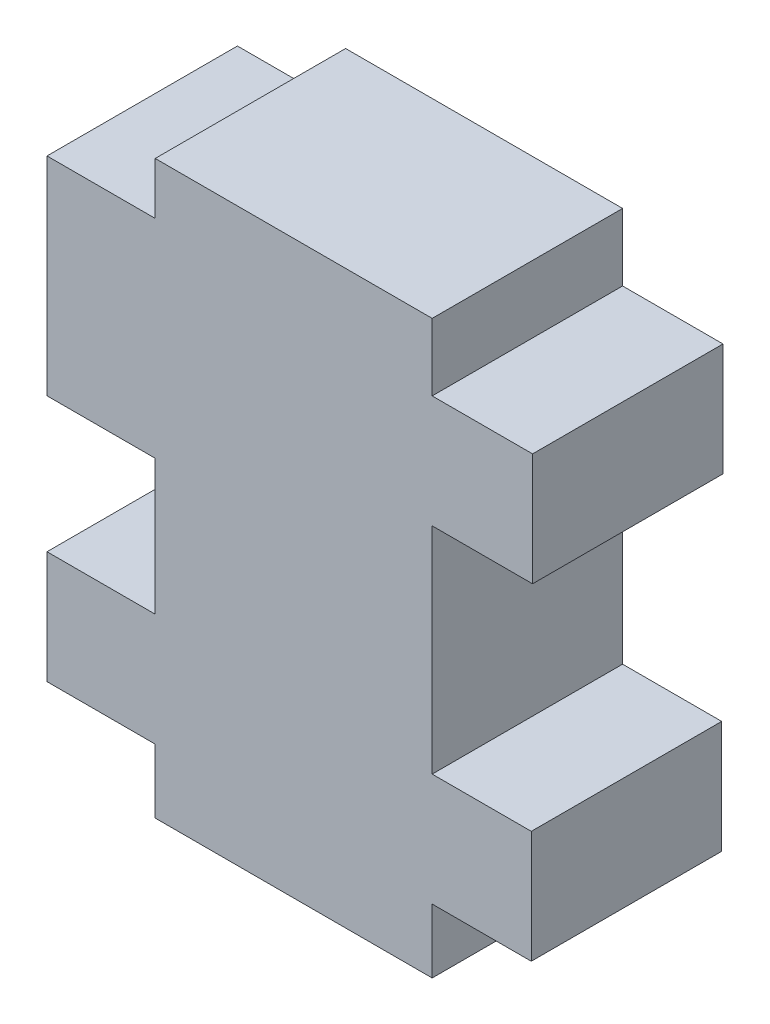
ISO-10303-21;
HEADER;
FILE_DESCRIPTION(('STEP AP214'),'2;1');
FILE_NAME('part.step','',(''),(''),'','','');
FILE_SCHEMA(('AUTOMOTIVE_DESIGN { 1 0 10303 214 1 1 1 1 }'));
ENDSEC;
DATA;
#1=APPLICATION_CONTEXT('core data for automotive mechanical design processes');
#2=APPLICATION_PROTOCOL_DEFINITION('international standard','automotive_design',2000,#1);
#3=PRODUCT_CONTEXT('',#1,'mechanical');
#4=PRODUCT('Part','Part','',(#3));
#5=PRODUCT_RELATED_PRODUCT_CATEGORY('part','',(#4));
#6=PRODUCT_DEFINITION_FORMATION('','',#4);
#7=PRODUCT_DEFINITION_CONTEXT('part definition',#1,'design');
#8=PRODUCT_DEFINITION('design','',#6,#7);
#9=PRODUCT_DEFINITION_SHAPE('','',#8);
#10=(LENGTH_UNIT() NAMED_UNIT(*) SI_UNIT(.MILLI.,.METRE.));
#11=(NAMED_UNIT(*) PLANE_ANGLE_UNIT() SI_UNIT($,.RADIAN.));
#12=(NAMED_UNIT(*) SI_UNIT($,.STERADIAN.) SOLID_ANGLE_UNIT());
#13=UNCERTAINTY_MEASURE_WITH_UNIT(LENGTH_MEASURE(1.E-05),#10,'distance_accuracy_value','');
#14=(GEOMETRIC_REPRESENTATION_CONTEXT(3) GLOBAL_UNCERTAINTY_ASSIGNED_CONTEXT((#13)) GLOBAL_UNIT_ASSIGNED_CONTEXT((#10,
#11,#12)) REPRESENTATION_CONTEXT('',''));
#15=CARTESIAN_POINT('',(0.,0.,0.));
#16=DIRECTION('',(0.,0.,1.));
#17=DIRECTION('',(1.,0.,0.));
#18=AXIS2_PLACEMENT_3D('',#15,#16,#17);
#19=CARTESIAN_POINT('',(-1.425,0.15,1.1));
#20=DIRECTION('',(1.,0.,0.));
#21=DIRECTION('',(0.,0.,-1.));
#22=AXIS2_PLACEMENT_3D('',#19,#20,#21);
#23=PLANE('',#22);
#24=DIRECTION('',(0.,-1.,0.));
#25=VECTOR('',#24,1.);
#26=CARTESIAN_POINT('',(-1.425,0.15,0.));
#27=LINE('',#26,#25);
#28=CARTESIAN_POINT('',(-1.425,1.35,0.));
#29=VERTEX_POINT('',#28);
#30=CARTESIAN_POINT('',(-1.425,0.15,0.));
#31=VERTEX_POINT('',#30);
#32=EDGE_CURVE('E202',#29,#31,#27,.T.);
#33=ORIENTED_EDGE('',*,*,#32,.T.);
#34=DIRECTION('',(0.,0.,-1.));
#35=VECTOR('',#34,1.);
#36=CARTESIAN_POINT('',(-1.425,0.15,1.1));
#37=LINE('',#36,#35);
#38=CARTESIAN_POINT('',(-1.425,0.15,1.1));
#39=VERTEX_POINT('',#38);
#40=EDGE_CURVE('E11',#39,#31,#37,.T.);
#41=ORIENTED_EDGE('',*,*,#40,.F.);
#42=DIRECTION('',(0.,-1.,0.));
#43=VECTOR('',#42,1.);
#44=CARTESIAN_POINT('',(-1.425,0.15,1.1));
#45=LINE('',#44,#43);
#46=CARTESIAN_POINT('',(-1.425,1.35,1.1));
#47=VERTEX_POINT('',#46);
#48=EDGE_CURVE('E240',#47,#39,#45,.T.);
#49=ORIENTED_EDGE('',*,*,#48,.F.);
#50=DIRECTION('',(0.,0.,-1.));
#51=VECTOR('',#50,1.);
#52=CARTESIAN_POINT('',(-1.425,1.35,1.1));
#53=LINE('',#52,#51);
#54=EDGE_CURVE('E198',#47,#29,#53,.T.);
#55=ORIENTED_EDGE('',*,*,#54,.T.);
#56=EDGE_LOOP('',(#33,#41,#49,#55));
#57=FACE_BOUND('',#56,.T.);
#58=ADVANCED_FACE('F34',(#57),#23,.F.);
#59=CARTESIAN_POINT('',(-0.8,0.15,1.1));
#60=DIRECTION('',(0.,1.,0.));
#61=DIRECTION('',(0.,0.,1.));
#62=AXIS2_PLACEMENT_3D('',#59,#60,#61);
#63=PLANE('',#62);
#64=DIRECTION('',(1.,0.,0.));
#65=VECTOR('',#64,1.);
#66=CARTESIAN_POINT('',(-0.8,0.15,0.));
#67=LINE('',#66,#65);
#68=CARTESIAN_POINT('',(-0.8,0.15,0.));
#69=VERTEX_POINT('',#68);
#70=EDGE_CURVE('E205',#31,#69,#67,.T.);
#71=ORIENTED_EDGE('',*,*,#70,.T.);
#72=DIRECTION('',(0.,0.,-1.));
#73=VECTOR('',#72,1.);
#74=CARTESIAN_POINT('',(-0.8,0.15,1.1));
#75=LINE('',#74,#73);
#76=CARTESIAN_POINT('',(-0.8,0.15,1.1));
#77=VERTEX_POINT('',#76);
#78=EDGE_CURVE('E42',#77,#69,#75,.T.);
#79=ORIENTED_EDGE('',*,*,#78,.F.);
#80=DIRECTION('',(1.,0.,0.));
#81=VECTOR('',#80,1.);
#82=CARTESIAN_POINT('',(-0.8,0.15,1.1));
#83=LINE('',#82,#81);
#84=EDGE_CURVE('E129',#39,#77,#83,.T.);
#85=ORIENTED_EDGE('',*,*,#84,.F.);
#86=ORIENTED_EDGE('',*,*,#40,.T.);
#87=EDGE_LOOP('',(#71,#79,#85,#86));
#88=FACE_BOUND('',#87,.T.);
#89=ADVANCED_FACE('F358',(#88),#63,.F.);
#90=CARTESIAN_POINT('',(-0.8,-0.63,1.1));
#91=DIRECTION('',(1.,0.,0.));
#92=DIRECTION('',(0.,0.,-1.));
#93=AXIS2_PLACEMENT_3D('',#90,#91,#92);
#94=PLANE('',#93);
#95=DIRECTION('',(0.,-1.,0.));
#96=VECTOR('',#95,1.);
#97=CARTESIAN_POINT('',(-0.8,-0.63,0.));
#98=LINE('',#97,#96);
#99=CARTESIAN_POINT('',(-0.8,-0.63,0.));
#100=VERTEX_POINT('',#99);
#101=EDGE_CURVE('E207',#69,#100,#98,.T.);
#102=ORIENTED_EDGE('',*,*,#101,.T.);
#103=DIRECTION('',(0.,0.,-1.));
#104=VECTOR('',#103,1.);
#105=CARTESIAN_POINT('',(-0.8,-0.63,1.1));
#106=LINE('',#105,#104);
#107=CARTESIAN_POINT('',(-0.8,-0.63,1.1));
#108=VERTEX_POINT('',#107);
#109=EDGE_CURVE('E283',#108,#100,#106,.T.);
#110=ORIENTED_EDGE('',*,*,#109,.F.);
#111=DIRECTION('',(0.,-1.,0.));
#112=VECTOR('',#111,1.);
#113=CARTESIAN_POINT('',(-0.8,-0.63,1.1));
#114=LINE('',#113,#112);
#115=EDGE_CURVE('E291',#77,#108,#114,.T.);
#116=ORIENTED_EDGE('',*,*,#115,.F.);
#117=ORIENTED_EDGE('',*,*,#78,.T.);
#118=EDGE_LOOP('',(#102,#110,#116,#117));
#119=FACE_BOUND('',#118,.T.);
#120=ADVANCED_FACE('F289',(#119),#94,.F.);
#121=CARTESIAN_POINT('',(-1.425,-0.63,1.1));
#122=DIRECTION('',(0.,-1.,0.));
#123=DIRECTION('',(0.,0.,-1.));
#124=AXIS2_PLACEMENT_3D('',#121,#122,#123);
#125=PLANE('',#124);
#126=DIRECTION('',(-1.,0.,0.));
#127=VECTOR('',#126,1.);
#128=CARTESIAN_POINT('',(-1.425,-0.63,0.));
#129=LINE('',#128,#127);
#130=CARTESIAN_POINT('',(-1.425,-0.63,0.));
#131=VERTEX_POINT('',#130);
#132=EDGE_CURVE('E209',#100,#131,#129,.T.);
#133=ORIENTED_EDGE('',*,*,#132,.T.);
#134=DIRECTION('',(0.,0.,-1.));
#135=VECTOR('',#134,1.);
#136=CARTESIAN_POINT('',(-1.425,-0.63,1.1));
#137=LINE('',#136,#135);
#138=CARTESIAN_POINT('',(-1.425,-0.63,1.1));
#139=VERTEX_POINT('',#138);
#140=EDGE_CURVE('E280',#139,#131,#137,.T.);
#141=ORIENTED_EDGE('',*,*,#140,.F.);
#142=DIRECTION('',(-1.,0.,0.));
#143=VECTOR('',#142,1.);
#144=CARTESIAN_POINT('',(-1.425,-0.63,1.1));
#145=LINE('',#144,#143);
#146=EDGE_CURVE('E309',#108,#139,#145,.T.);
#147=ORIENTED_EDGE('',*,*,#146,.F.);
#148=ORIENTED_EDGE('',*,*,#109,.T.);
#149=EDGE_LOOP('',(#133,#141,#147,#148));
#150=FACE_BOUND('',#149,.T.);
#151=ADVANCED_FACE('F300',(#150),#125,.F.);
#152=CARTESIAN_POINT('',(-1.425,-1.28,1.1));
#153=DIRECTION('',(1.,0.,0.));
#154=DIRECTION('',(0.,0.,-1.));
#155=AXIS2_PLACEMENT_3D('',#152,#153,#154);
#156=PLANE('',#155);
#157=DIRECTION('',(0.,-1.,0.));
#158=VECTOR('',#157,1.);
#159=CARTESIAN_POINT('',(-1.425,-1.28,0.));
#160=LINE('',#159,#158);
#161=CARTESIAN_POINT('',(-1.425,-1.28,0.));
#162=VERTEX_POINT('',#161);
#163=EDGE_CURVE('E211',#131,#162,#160,.T.);
#164=ORIENTED_EDGE('',*,*,#163,.T.);
#165=DIRECTION('',(0.,0.,-1.));
#166=VECTOR('',#165,1.);
#167=CARTESIAN_POINT('',(-1.425,-1.28,1.1));
#168=LINE('',#167,#166);
#169=CARTESIAN_POINT('',(-1.425,-1.28,1.1));
#170=VERTEX_POINT('',#169);
#171=EDGE_CURVE('E277',#170,#162,#168,.T.);
#172=ORIENTED_EDGE('',*,*,#171,.F.);
#173=DIRECTION('',(0.,-1.,0.));
#174=VECTOR('',#173,1.);
#175=CARTESIAN_POINT('',(-1.425,-1.28,1.1));
#176=LINE('',#175,#174);
#177=EDGE_CURVE('E306',#139,#170,#176,.T.);
#178=ORIENTED_EDGE('',*,*,#177,.F.);
#179=ORIENTED_EDGE('',*,*,#140,.T.);
#180=EDGE_LOOP('',(#164,#172,#178,#179));
#181=FACE_BOUND('',#180,.T.);
#182=ADVANCED_FACE('F304',(#181),#156,.F.);
#183=CARTESIAN_POINT('',(-0.8,-1.28,1.1));
#184=DIRECTION('',(0.,1.,0.));
#185=DIRECTION('',(0.,0.,1.));
#186=AXIS2_PLACEMENT_3D('',#183,#184,#185);
#187=PLANE('',#186);
#188=DIRECTION('',(1.,0.,0.));
#189=VECTOR('',#188,1.);
#190=CARTESIAN_POINT('',(-0.8,-1.28,0.));
#191=LINE('',#190,#189);
#192=CARTESIAN_POINT('',(-0.8,-1.28,0.));
#193=VERTEX_POINT('',#192);
#194=EDGE_CURVE('E213',#162,#193,#191,.T.);
#195=ORIENTED_EDGE('',*,*,#194,.T.);
#196=DIRECTION('',(0.,0.,-1.));
#197=VECTOR('',#196,1.);
#198=CARTESIAN_POINT('',(-0.8,-1.28,1.1));
#199=LINE('',#198,#197);
#200=CARTESIAN_POINT('',(-0.8,-1.28,1.1));
#201=VERTEX_POINT('',#200);
#202=EDGE_CURVE('E274',#201,#193,#199,.T.);
#203=ORIENTED_EDGE('',*,*,#202,.F.);
#204=DIRECTION('',(1.,0.,0.));
#205=VECTOR('',#204,1.);
#206=CARTESIAN_POINT('',(-0.8,-1.28,1.1));
#207=LINE('',#206,#205);
#208=EDGE_CURVE('E308',#170,#201,#207,.T.);
#209=ORIENTED_EDGE('',*,*,#208,.F.);
#210=ORIENTED_EDGE('',*,*,#171,.T.);
#211=EDGE_LOOP('',(#195,#203,#209,#210));
#212=FACE_BOUND('',#211,.T.);
#213=ADVANCED_FACE('F371',(#212),#187,.F.);
#214=CARTESIAN_POINT('',(-0.8,-1.65,1.1));
#215=DIRECTION('',(1.,0.,0.));
#216=DIRECTION('',(0.,0.,-1.));
#217=AXIS2_PLACEMENT_3D('',#214,#215,#216);
#218=PLANE('',#217);
#219=DIRECTION('',(0.,-1.,0.));
#220=VECTOR('',#219,1.);
#221=CARTESIAN_POINT('',(-0.8,-1.65,0.));
#222=LINE('',#221,#220);
#223=CARTESIAN_POINT('',(-0.8,-1.65,0.));
#224=VERTEX_POINT('',#223);
#225=EDGE_CURVE('E215',#193,#224,#222,.T.);
#226=ORIENTED_EDGE('',*,*,#225,.T.);
#227=DIRECTION('',(0.,0.,-1.));
#228=VECTOR('',#227,1.);
#229=CARTESIAN_POINT('',(-0.8,-1.65,1.1));
#230=LINE('',#229,#228);
#231=CARTESIAN_POINT('',(-0.8,-1.65,1.1));
#232=VERTEX_POINT('',#231);
#233=EDGE_CURVE('E271',#232,#224,#230,.T.);
#234=ORIENTED_EDGE('',*,*,#233,.F.);
#235=DIRECTION('',(0.,-1.,0.));
#236=VECTOR('',#235,1.);
#237=CARTESIAN_POINT('',(-0.8,-1.65,1.1));
#238=LINE('',#237,#236);
#239=EDGE_CURVE('E311',#201,#232,#238,.T.);
#240=ORIENTED_EDGE('',*,*,#239,.F.);
#241=ORIENTED_EDGE('',*,*,#202,.T.);
#242=EDGE_LOOP('',(#226,#234,#240,#241));
#243=FACE_BOUND('',#242,.T.);
#244=ADVANCED_FACE('F374',(#243),#218,.F.);
#245=CARTESIAN_POINT('',(0.8,-1.65,1.1));
#246=DIRECTION('',(0.,1.,0.));
#247=DIRECTION('',(0.,0.,1.));
#248=AXIS2_PLACEMENT_3D('',#245,#246,#247);
#249=PLANE('',#248);
#250=DIRECTION('',(1.,0.,0.));
#251=VECTOR('',#250,1.);
#252=CARTESIAN_POINT('',(0.8,-1.65,0.));
#253=LINE('',#252,#251);
#254=CARTESIAN_POINT('',(0.8,-1.65,0.));
#255=VERTEX_POINT('',#254);
#256=EDGE_CURVE('E217',#224,#255,#253,.T.);
#257=ORIENTED_EDGE('',*,*,#256,.T.);
#258=DIRECTION('',(0.,0.,-1.));
#259=VECTOR('',#258,1.);
#260=CARTESIAN_POINT('',(0.8,-1.65,1.1));
#261=LINE('',#260,#259);
#262=CARTESIAN_POINT('',(0.8,-1.65,1.1));
#263=VERTEX_POINT('',#262);
#264=EDGE_CURVE('E268',#263,#255,#261,.T.);
#265=ORIENTED_EDGE('',*,*,#264,.F.);
#266=DIRECTION('',(1.,0.,0.));
#267=VECTOR('',#266,1.);
#268=CARTESIAN_POINT('',(0.8,-1.65,1.1));
#269=LINE('',#268,#267);
#270=EDGE_CURVE('E317',#232,#263,#269,.T.);
#271=ORIENTED_EDGE('',*,*,#270,.F.);
#272=ORIENTED_EDGE('',*,*,#233,.T.);
#273=EDGE_LOOP('',(#257,#265,#271,#272));
#274=FACE_BOUND('',#273,.T.);
#275=ADVANCED_FACE('F378',(#274),#249,.F.);
#276=CARTESIAN_POINT('',(0.8,-1.28,1.1));
#277=DIRECTION('',(-1.,0.,0.));
#278=DIRECTION('',(0.,0.,1.));
#279=AXIS2_PLACEMENT_3D('',#276,#277,#278);
#280=PLANE('',#279);
#281=DIRECTION('',(0.,1.,0.));
#282=VECTOR('',#281,1.);
#283=CARTESIAN_POINT('',(0.8,-1.28,0.));
#284=LINE('',#283,#282);
#285=CARTESIAN_POINT('',(0.8,-1.28,0.));
#286=VERTEX_POINT('',#285);
#287=EDGE_CURVE('E219',#255,#286,#284,.T.);
#288=ORIENTED_EDGE('',*,*,#287,.T.);
#289=DIRECTION('',(0.,0.,-1.));
#290=VECTOR('',#289,1.);
#291=CARTESIAN_POINT('',(0.8,-1.28,1.1));
#292=LINE('',#291,#290);
#293=CARTESIAN_POINT('',(0.8,-1.28,1.1));
#294=VERTEX_POINT('',#293);
#295=EDGE_CURVE('E265',#294,#286,#292,.T.);
#296=ORIENTED_EDGE('',*,*,#295,.F.);
#297=DIRECTION('',(0.,1.,0.));
#298=VECTOR('',#297,1.);
#299=CARTESIAN_POINT('',(0.8,-1.28,1.1));
#300=LINE('',#299,#298);
#301=EDGE_CURVE('E319',#263,#294,#300,.T.);
#302=ORIENTED_EDGE('',*,*,#301,.F.);
#303=ORIENTED_EDGE('',*,*,#264,.T.);
#304=EDGE_LOOP('',(#288,#296,#302,#303));
#305=FACE_BOUND('',#304,.T.);
#306=ADVANCED_FACE('F382',(#305),#280,.F.);
#307=CARTESIAN_POINT('',(1.3725,-1.28,1.1));
#308=DIRECTION('',(0.,1.,0.));
#309=DIRECTION('',(0.,0.,1.));
#310=AXIS2_PLACEMENT_3D('',#307,#308,#309);
#311=PLANE('',#310);
#312=DIRECTION('',(1.,0.,0.));
#313=VECTOR('',#312,1.);
#314=CARTESIAN_POINT('',(1.3725,-1.28,0.));
#315=LINE('',#314,#313);
#316=CARTESIAN_POINT('',(1.3725,-1.28,0.));
#317=VERTEX_POINT('',#316);
#318=EDGE_CURVE('E221',#286,#317,#315,.T.);
#319=ORIENTED_EDGE('',*,*,#318,.T.);
#320=DIRECTION('',(0.,0.,-1.));
#321=VECTOR('',#320,1.);
#322=CARTESIAN_POINT('',(1.3725,-1.28,1.1));
#323=LINE('',#322,#321);
#324=CARTESIAN_POINT('',(1.3725,-1.28,1.1));
#325=VERTEX_POINT('',#324);
#326=EDGE_CURVE('E262',#325,#317,#323,.T.);
#327=ORIENTED_EDGE('',*,*,#326,.F.);
#328=DIRECTION('',(1.,0.,0.));
#329=VECTOR('',#328,1.);
#330=CARTESIAN_POINT('',(1.3725,-1.28,1.1));
#331=LINE('',#330,#329);
#332=EDGE_CURVE('E321',#294,#325,#331,.T.);
#333=ORIENTED_EDGE('',*,*,#332,.F.);
#334=ORIENTED_EDGE('',*,*,#295,.T.);
#335=EDGE_LOOP('',(#319,#327,#333,#334));
#336=FACE_BOUND('',#335,.T.);
#337=ADVANCED_FACE('F386',(#336),#311,.F.);
#338=CARTESIAN_POINT('',(1.3725,-0.63,1.1));
#339=DIRECTION('',(-1.,0.,0.));
#340=DIRECTION('',(0.,0.,1.));
#341=AXIS2_PLACEMENT_3D('',#338,#339,#340);
#342=PLANE('',#341);
#343=DIRECTION('',(0.,1.,0.));
#344=VECTOR('',#343,1.);
#345=CARTESIAN_POINT('',(1.3725,-0.63,0.));
#346=LINE('',#345,#344);
#347=CARTESIAN_POINT('',(1.3725,-0.63,0.));
#348=VERTEX_POINT('',#347);
#349=EDGE_CURVE('E223',#317,#348,#346,.T.);
#350=ORIENTED_EDGE('',*,*,#349,.T.);
#351=DIRECTION('',(0.,0.,-1.));
#352=VECTOR('',#351,1.);
#353=CARTESIAN_POINT('',(1.3725,-0.63,1.1));
#354=LINE('',#353,#352);
#355=CARTESIAN_POINT('',(1.3725,-0.63,1.1));
#356=VERTEX_POINT('',#355);
#357=EDGE_CURVE('E259',#356,#348,#354,.T.);
#358=ORIENTED_EDGE('',*,*,#357,.F.);
#359=DIRECTION('',(0.,1.,0.));
#360=VECTOR('',#359,1.);
#361=CARTESIAN_POINT('',(1.3725,-0.63,1.1));
#362=LINE('',#361,#360);
#363=EDGE_CURVE('E323',#325,#356,#362,.T.);
#364=ORIENTED_EDGE('',*,*,#363,.F.);
#365=ORIENTED_EDGE('',*,*,#326,.T.);
#366=EDGE_LOOP('',(#350,#358,#364,#365));
#367=FACE_BOUND('',#366,.T.);
#368=ADVANCED_FACE('F390',(#367),#342,.F.);
#369=CARTESIAN_POINT('',(0.8,-0.63,1.1));
#370=DIRECTION('',(0.,-1.,0.));
#371=DIRECTION('',(0.,0.,-1.));
#372=AXIS2_PLACEMENT_3D('',#369,#370,#371);
#373=PLANE('',#372);
#374=DIRECTION('',(-1.,0.,0.));
#375=VECTOR('',#374,1.);
#376=CARTESIAN_POINT('',(0.8,-0.63,0.));
#377=LINE('',#376,#375);
#378=CARTESIAN_POINT('',(0.8,-0.63,0.));
#379=VERTEX_POINT('',#378);
#380=EDGE_CURVE('E225',#348,#379,#377,.T.);
#381=ORIENTED_EDGE('',*,*,#380,.T.);
#382=DIRECTION('',(0.,0.,-1.));
#383=VECTOR('',#382,1.);
#384=CARTESIAN_POINT('',(0.8,-0.63,1.1));
#385=LINE('',#384,#383);
#386=CARTESIAN_POINT('',(0.8,-0.63,1.1));
#387=VERTEX_POINT('',#386);
#388=EDGE_CURVE('E256',#387,#379,#385,.T.);
#389=ORIENTED_EDGE('',*,*,#388,.F.);
#390=DIRECTION('',(-1.,0.,0.));
#391=VECTOR('',#390,1.);
#392=CARTESIAN_POINT('',(0.8,-0.63,1.1));
#393=LINE('',#392,#391);
#394=EDGE_CURVE('E325',#356,#387,#393,.T.);
#395=ORIENTED_EDGE('',*,*,#394,.F.);
#396=ORIENTED_EDGE('',*,*,#357,.T.);
#397=EDGE_LOOP('',(#381,#389,#395,#396));
#398=FACE_BOUND('',#397,.T.);
#399=ADVANCED_FACE('F394',(#398),#373,.F.);
#400=CARTESIAN_POINT('',(0.8,0.612,1.1));
#401=DIRECTION('',(-1.,0.,0.));
#402=DIRECTION('',(0.,0.,1.));
#403=AXIS2_PLACEMENT_3D('',#400,#401,#402);
#404=PLANE('',#403);
#405=DIRECTION('',(0.,1.,0.));
#406=VECTOR('',#405,1.);
#407=CARTESIAN_POINT('',(0.8,0.612,0.));
#408=LINE('',#407,#406);
#409=CARTESIAN_POINT('',(0.8,0.612,0.));
#410=VERTEX_POINT('',#409);
#411=EDGE_CURVE('E227',#379,#410,#408,.T.);
#412=ORIENTED_EDGE('',*,*,#411,.T.);
#413=DIRECTION('',(0.,0.,-1.));
#414=VECTOR('',#413,1.);
#415=CARTESIAN_POINT('',(0.8,0.612,1.1));
#416=LINE('',#415,#414);
#417=CARTESIAN_POINT('',(0.8,0.612,1.1));
#418=VERTEX_POINT('',#417);
#419=EDGE_CURVE('E253',#418,#410,#416,.T.);
#420=ORIENTED_EDGE('',*,*,#419,.F.);
#421=DIRECTION('',(0.,1.,0.));
#422=VECTOR('',#421,1.);
#423=CARTESIAN_POINT('',(0.8,0.612,1.1));
#424=LINE('',#423,#422);
#425=EDGE_CURVE('E327',#387,#418,#424,.T.);
#426=ORIENTED_EDGE('',*,*,#425,.F.);
#427=ORIENTED_EDGE('',*,*,#388,.T.);
#428=EDGE_LOOP('',(#412,#420,#426,#427));
#429=FACE_BOUND('',#428,.T.);
#430=ADVANCED_FACE('F398',(#429),#404,.F.);
#431=CARTESIAN_POINT('',(1.38,0.612,1.1));
#432=DIRECTION('',(0.,1.,0.));
#433=DIRECTION('',(0.,0.,1.));
#434=AXIS2_PLACEMENT_3D('',#431,#432,#433);
#435=PLANE('',#434);
#436=DIRECTION('',(1.,0.,0.));
#437=VECTOR('',#436,1.);
#438=CARTESIAN_POINT('',(1.38,0.612,0.));
#439=LINE('',#438,#437);
#440=CARTESIAN_POINT('',(1.38,0.612,0.));
#441=VERTEX_POINT('',#440);
#442=EDGE_CURVE('E229',#410,#441,#439,.T.);
#443=ORIENTED_EDGE('',*,*,#442,.T.);
#444=DIRECTION('',(0.,0.,-1.));
#445=VECTOR('',#444,1.);
#446=CARTESIAN_POINT('',(1.38,0.612,1.1));
#447=LINE('',#446,#445);
#448=CARTESIAN_POINT('',(1.38,0.612,1.1));
#449=VERTEX_POINT('',#448);
#450=EDGE_CURVE('E250',#449,#441,#447,.T.);
#451=ORIENTED_EDGE('',*,*,#450,.F.);
#452=DIRECTION('',(1.,0.,0.));
#453=VECTOR('',#452,1.);
#454=CARTESIAN_POINT('',(1.38,0.612,1.1));
#455=LINE('',#454,#453);
#456=EDGE_CURVE('E329',#418,#449,#455,.T.);
#457=ORIENTED_EDGE('',*,*,#456,.F.);
#458=ORIENTED_EDGE('',*,*,#419,.T.);
#459=EDGE_LOOP('',(#443,#451,#457,#458));
#460=FACE_BOUND('',#459,.T.);
#461=ADVANCED_FACE('F402',(#460),#435,.F.);
#462=CARTESIAN_POINT('',(1.38,1.262,1.1));
#463=DIRECTION('',(-1.,0.,0.));
#464=DIRECTION('',(0.,0.,1.));
#465=AXIS2_PLACEMENT_3D('',#462,#463,#464);
#466=PLANE('',#465);
#467=DIRECTION('',(0.,1.,0.));
#468=VECTOR('',#467,1.);
#469=CARTESIAN_POINT('',(1.38,1.262,0.));
#470=LINE('',#469,#468);
#471=CARTESIAN_POINT('',(1.38,1.262,0.));
#472=VERTEX_POINT('',#471);
#473=EDGE_CURVE('E231',#441,#472,#470,.T.);
#474=ORIENTED_EDGE('',*,*,#473,.T.);
#475=DIRECTION('',(0.,0.,-1.));
#476=VECTOR('',#475,1.);
#477=CARTESIAN_POINT('',(1.38,1.262,1.1));
#478=LINE('',#477,#476);
#479=CARTESIAN_POINT('',(1.38,1.262,1.1));
#480=VERTEX_POINT('',#479);
#481=EDGE_CURVE('E247',#480,#472,#478,.T.);
#482=ORIENTED_EDGE('',*,*,#481,.F.);
#483=DIRECTION('',(0.,1.,0.));
#484=VECTOR('',#483,1.);
#485=CARTESIAN_POINT('',(1.38,1.262,1.1));
#486=LINE('',#485,#484);
#487=EDGE_CURVE('E331',#449,#480,#486,.T.);
#488=ORIENTED_EDGE('',*,*,#487,.F.);
#489=ORIENTED_EDGE('',*,*,#450,.T.);
#490=EDGE_LOOP('',(#474,#482,#488,#489));
#491=FACE_BOUND('',#490,.T.);
#492=ADVANCED_FACE('F406',(#491),#466,.F.);
#493=CARTESIAN_POINT('',(0.8,1.262,1.1));
#494=DIRECTION('',(0.,-1.,0.));
#495=DIRECTION('',(0.,0.,-1.));
#496=AXIS2_PLACEMENT_3D('',#493,#494,#495);
#497=PLANE('',#496);
#498=DIRECTION('',(-1.,0.,0.));
#499=VECTOR('',#498,1.);
#500=CARTESIAN_POINT('',(0.8,1.262,0.));
#501=LINE('',#500,#499);
#502=CARTESIAN_POINT('',(0.8,1.262,0.));
#503=VERTEX_POINT('',#502);
#504=EDGE_CURVE('E233',#472,#503,#501,.T.);
#505=ORIENTED_EDGE('',*,*,#504,.T.);
#506=DIRECTION('',(0.,0.,-1.));
#507=VECTOR('',#506,1.);
#508=CARTESIAN_POINT('',(0.8,1.262,1.1));
#509=LINE('',#508,#507);
#510=CARTESIAN_POINT('',(0.8,1.262,1.1));
#511=VERTEX_POINT('',#510);
#512=EDGE_CURVE('E244',#511,#503,#509,.T.);
#513=ORIENTED_EDGE('',*,*,#512,.F.);
#514=DIRECTION('',(-1.,0.,0.));
#515=VECTOR('',#514,1.);
#516=CARTESIAN_POINT('',(0.8,1.262,1.1));
#517=LINE('',#516,#515);
#518=EDGE_CURVE('E333',#480,#511,#517,.T.);
#519=ORIENTED_EDGE('',*,*,#518,.F.);
#520=ORIENTED_EDGE('',*,*,#481,.T.);
#521=EDGE_LOOP('',(#505,#513,#519,#520));
#522=FACE_BOUND('',#521,.T.);
#523=ADVANCED_FACE('F339',(#522),#497,.F.);
#524=CARTESIAN_POINT('',(0.8,1.65,1.1));
#525=DIRECTION('',(-1.,0.,0.));
#526=DIRECTION('',(0.,0.,1.));
#527=AXIS2_PLACEMENT_3D('',#524,#525,#526);
#528=PLANE('',#527);
#529=DIRECTION('',(0.,1.,0.));
#530=VECTOR('',#529,1.);
#531=CARTESIAN_POINT('',(0.8,1.65,0.));
#532=LINE('',#531,#530);
#533=CARTESIAN_POINT('',(0.8,1.65,0.));
#534=VERTEX_POINT('',#533);
#535=EDGE_CURVE('E235',#503,#534,#532,.T.);
#536=ORIENTED_EDGE('',*,*,#535,.T.);
#537=DIRECTION('',(0.,0.,-1.));
#538=VECTOR('',#537,1.);
#539=CARTESIAN_POINT('',(0.8,1.65,1.1));
#540=LINE('',#539,#538);
#541=CARTESIAN_POINT('',(0.8,1.65,1.1));
#542=VERTEX_POINT('',#541);
#543=EDGE_CURVE('E193',#542,#534,#540,.T.);
#544=ORIENTED_EDGE('',*,*,#543,.F.);
#545=DIRECTION('',(0.,1.,0.));
#546=VECTOR('',#545,1.);
#547=CARTESIAN_POINT('',(0.8,1.65,1.1));
#548=LINE('',#547,#546);
#549=EDGE_CURVE('E184',#511,#542,#548,.T.);
#550=ORIENTED_EDGE('',*,*,#549,.F.);
#551=ORIENTED_EDGE('',*,*,#512,.T.);
#552=EDGE_LOOP('',(#536,#544,#550,#551));
#553=FACE_BOUND('',#552,.T.);
#554=ADVANCED_FACE('F343',(#553),#528,.F.);
#555=CARTESIAN_POINT('',(-0.8,1.65,1.1));
#556=DIRECTION('',(0.,-1.,0.));
#557=DIRECTION('',(0.,0.,-1.));
#558=AXIS2_PLACEMENT_3D('',#555,#556,#557);
#559=PLANE('',#558);
#560=DIRECTION('',(-1.,0.,0.));
#561=VECTOR('',#560,1.);
#562=CARTESIAN_POINT('',(-0.8,1.65,0.));
#563=LINE('',#562,#561);
#564=CARTESIAN_POINT('',(-0.8,1.65,0.));
#565=VERTEX_POINT('',#564);
#566=EDGE_CURVE('E192',#534,#565,#563,.T.);
#567=ORIENTED_EDGE('',*,*,#566,.T.);
#568=DIRECTION('',(0.,0.,-1.));
#569=VECTOR('',#568,1.);
#570=CARTESIAN_POINT('',(-0.8,1.65,1.1));
#571=LINE('',#570,#569);
#572=CARTESIAN_POINT('',(-0.8,1.65,1.1));
#573=VERTEX_POINT('',#572);
#574=EDGE_CURVE('E189',#573,#565,#571,.T.);
#575=ORIENTED_EDGE('',*,*,#574,.F.);
#576=DIRECTION('',(-1.,0.,0.));
#577=VECTOR('',#576,1.);
#578=CARTESIAN_POINT('',(-0.8,1.65,1.1));
#579=LINE('',#578,#577);
#580=EDGE_CURVE('E178',#542,#573,#579,.T.);
#581=ORIENTED_EDGE('',*,*,#580,.F.);
#582=ORIENTED_EDGE('',*,*,#543,.T.);
#583=EDGE_LOOP('',(#567,#575,#581,#582));
#584=FACE_BOUND('',#583,.T.);
#585=ADVANCED_FACE('F190',(#584),#559,.F.);
#586=CARTESIAN_POINT('',(-0.8,1.35,1.1));
#587=DIRECTION('',(1.,0.,0.));
#588=DIRECTION('',(0.,0.,-1.));
#589=AXIS2_PLACEMENT_3D('',#586,#587,#588);
#590=PLANE('',#589);
#591=DIRECTION('',(0.,-1.,0.));
#592=VECTOR('',#591,1.);
#593=CARTESIAN_POINT('',(-0.8,1.35,0.));
#594=LINE('',#593,#592);
#595=CARTESIAN_POINT('',(-0.8,1.35,0.));
#596=VERTEX_POINT('',#595);
#597=EDGE_CURVE('E115',#565,#596,#594,.T.);
#598=ORIENTED_EDGE('',*,*,#597,.T.);
#599=DIRECTION('',(0.,0.,-1.));
#600=VECTOR('',#599,1.);
#601=CARTESIAN_POINT('',(-0.8,1.35,1.1));
#602=LINE('',#601,#600);
#603=CARTESIAN_POINT('',(-0.8,1.35,1.1));
#604=VERTEX_POINT('',#603);
#605=EDGE_CURVE('E194',#604,#596,#602,.T.);
#606=ORIENTED_EDGE('',*,*,#605,.F.);
#607=DIRECTION('',(0.,-1.,0.));
#608=VECTOR('',#607,1.);
#609=CARTESIAN_POINT('',(-0.8,1.35,1.1));
#610=LINE('',#609,#608);
#611=EDGE_CURVE('E182',#573,#604,#610,.T.);
#612=ORIENTED_EDGE('',*,*,#611,.F.);
#613=ORIENTED_EDGE('',*,*,#574,.T.);
#614=EDGE_LOOP('',(#598,#606,#612,#613));
#615=FACE_BOUND('',#614,.T.);
#616=ADVANCED_FACE('F196',(#615),#590,.F.);
#617=CARTESIAN_POINT('',(-1.425,1.35,1.1));
#618=DIRECTION('',(0.,-1.,0.));
#619=DIRECTION('',(0.,0.,-1.));
#620=AXIS2_PLACEMENT_3D('',#617,#618,#619);
#621=PLANE('',#620);
#622=DIRECTION('',(-1.,0.,0.));
#623=VECTOR('',#622,1.);
#624=CARTESIAN_POINT('',(-1.425,1.35,0.));
#625=LINE('',#624,#623);
#626=EDGE_CURVE('E121',#596,#29,#625,.T.);
#627=ORIENTED_EDGE('',*,*,#626,.T.);
#628=ORIENTED_EDGE('',*,*,#54,.F.);
#629=DIRECTION('',(-1.,0.,0.));
#630=VECTOR('',#629,1.);
#631=CARTESIAN_POINT('',(-1.425,1.35,1.1));
#632=LINE('',#631,#630);
#633=EDGE_CURVE('E50',#604,#47,#632,.T.);
#634=ORIENTED_EDGE('',*,*,#633,.F.);
#635=ORIENTED_EDGE('',*,*,#605,.T.);
#636=EDGE_LOOP('',(#627,#628,#634,#635));
#637=FACE_BOUND('',#636,.T.);
#638=ADVANCED_FACE('F347',(#637),#621,.F.);
#639=CARTESIAN_POINT('',(0.,0.,1.1));
#640=DIRECTION('',(0.,0.,-1.));
#641=DIRECTION('',(-1.,0.,0.));
#642=AXIS2_PLACEMENT_3D('',#639,#640,#641);
#643=PLANE('',#642);
#644=ORIENTED_EDGE('',*,*,#48,.T.);
#645=ORIENTED_EDGE('',*,*,#84,.T.);
#646=ORIENTED_EDGE('',*,*,#115,.T.);
#647=ORIENTED_EDGE('',*,*,#146,.T.);
#648=ORIENTED_EDGE('',*,*,#177,.T.);
#649=ORIENTED_EDGE('',*,*,#208,.T.);
#650=ORIENTED_EDGE('',*,*,#239,.T.);
#651=ORIENTED_EDGE('',*,*,#270,.T.);
#652=ORIENTED_EDGE('',*,*,#301,.T.);
#653=ORIENTED_EDGE('',*,*,#332,.T.);
#654=ORIENTED_EDGE('',*,*,#363,.T.);
#655=ORIENTED_EDGE('',*,*,#394,.T.);
#656=ORIENTED_EDGE('',*,*,#425,.T.);
#657=ORIENTED_EDGE('',*,*,#456,.T.);
#658=ORIENTED_EDGE('',*,*,#487,.T.);
#659=ORIENTED_EDGE('',*,*,#518,.T.);
#660=ORIENTED_EDGE('',*,*,#549,.T.);
#661=ORIENTED_EDGE('',*,*,#580,.T.);
#662=ORIENTED_EDGE('',*,*,#611,.T.);
#663=ORIENTED_EDGE('',*,*,#633,.T.);
#664=EDGE_LOOP('',(#644,#645,#646,#647,#648,#649,#650,#651,#652,#653,#654,#655,#656,#657,#658,
#659,#660,#661,#662,#663));
#665=FACE_BOUND('',#664,.T.);
#666=ADVANCED_FACE('F180',(#665),#643,.F.);
#667=CARTESIAN_POINT('',(0.,0.,0.));
#668=DIRECTION('',(0.,0.,-1.));
#669=DIRECTION('',(-1.,0.,0.));
#670=AXIS2_PLACEMENT_3D('',#667,#668,#669);
#671=PLANE('',#670);
#672=ORIENTED_EDGE('',*,*,#32,.F.);
#673=ORIENTED_EDGE('',*,*,#626,.F.);
#674=ORIENTED_EDGE('',*,*,#597,.F.);
#675=ORIENTED_EDGE('',*,*,#566,.F.);
#676=ORIENTED_EDGE('',*,*,#535,.F.);
#677=ORIENTED_EDGE('',*,*,#504,.F.);
#678=ORIENTED_EDGE('',*,*,#473,.F.);
#679=ORIENTED_EDGE('',*,*,#442,.F.);
#680=ORIENTED_EDGE('',*,*,#411,.F.);
#681=ORIENTED_EDGE('',*,*,#380,.F.);
#682=ORIENTED_EDGE('',*,*,#349,.F.);
#683=ORIENTED_EDGE('',*,*,#318,.F.);
#684=ORIENTED_EDGE('',*,*,#287,.F.);
#685=ORIENTED_EDGE('',*,*,#256,.F.);
#686=ORIENTED_EDGE('',*,*,#225,.F.);
#687=ORIENTED_EDGE('',*,*,#194,.F.);
#688=ORIENTED_EDGE('',*,*,#163,.F.);
#689=ORIENTED_EDGE('',*,*,#132,.F.);
#690=ORIENTED_EDGE('',*,*,#101,.F.);
#691=ORIENTED_EDGE('',*,*,#70,.F.);
#692=EDGE_LOOP('',(#672,#673,#674,#675,#676,#677,#678,#679,#680,#681,#682,#683,#684,#685,#686,
#687,#688,#689,#690,#691));
#693=FACE_BOUND('',#692,.T.);
#694=ADVANCED_FACE('F295',(#693),#671,.T.);
#695=CLOSED_SHELL('',(#58,#89,#120,#151,#182,#213,#244,#275,#306,#337,#368,#399,#430,#461,#492,
#523,#554,#585,#616,#638,#666,#694));
#696=MANIFOLD_SOLID_BREP('B2',#695);
#697=ADVANCED_BREP_SHAPE_REPRESENTATION('',(#18,#696),#14);
#698=SHAPE_DEFINITION_REPRESENTATION(#9,#697);
ENDSEC;
END-ISO-10303-21;
